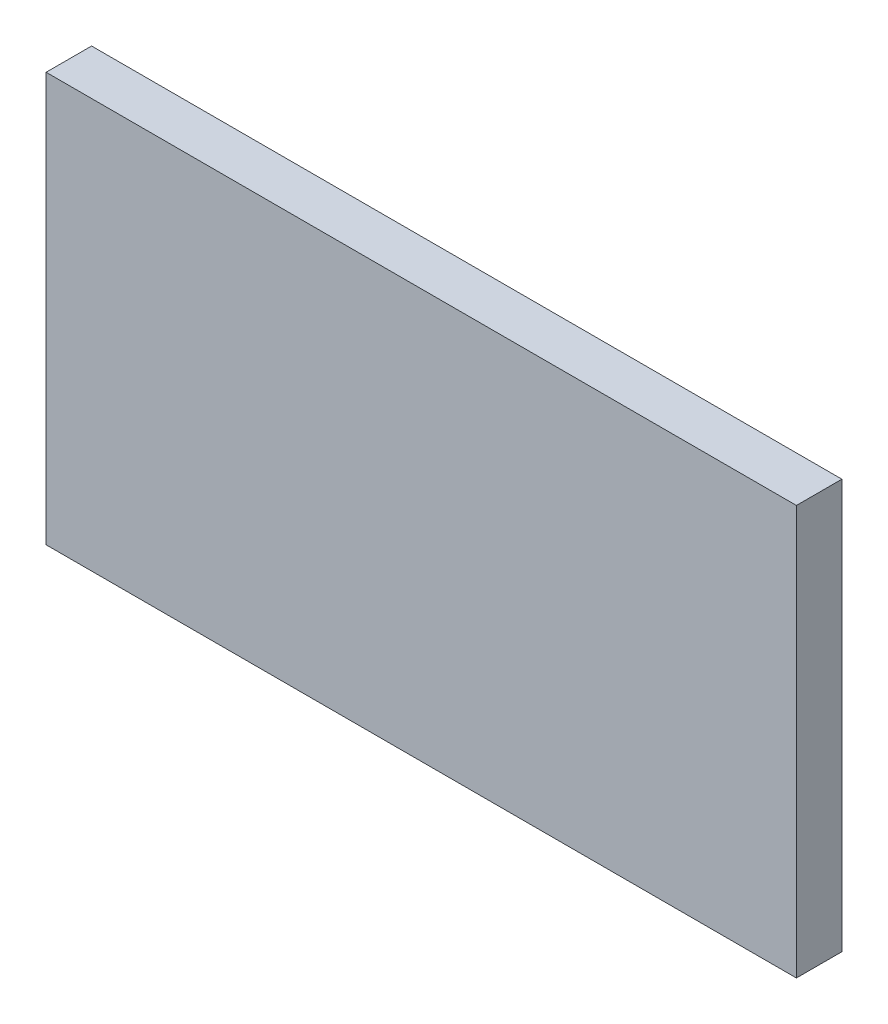
ISO-10303-21;
HEADER;
FILE_DESCRIPTION(('STEP AP214'),'2;1');
FILE_NAME('part.step','',(''),(''),'','','');
FILE_SCHEMA(('AUTOMOTIVE_DESIGN { 1 0 10303 214 1 1 1 1 }'));
ENDSEC;
DATA;
#1=APPLICATION_CONTEXT('core data for automotive mechanical design processes');
#2=APPLICATION_PROTOCOL_DEFINITION('international standard','automotive_design',2000,#1);
#3=PRODUCT_CONTEXT('',#1,'mechanical');
#4=PRODUCT('Part','Part','',(#3));
#5=PRODUCT_RELATED_PRODUCT_CATEGORY('part','',(#4));
#6=PRODUCT_DEFINITION_FORMATION('','',#4);
#7=PRODUCT_DEFINITION_CONTEXT('part definition',#1,'design');
#8=PRODUCT_DEFINITION('design','',#6,#7);
#9=PRODUCT_DEFINITION_SHAPE('','',#8);
#10=(LENGTH_UNIT() NAMED_UNIT(*) SI_UNIT(.MILLI.,.METRE.));
#11=(NAMED_UNIT(*) PLANE_ANGLE_UNIT() SI_UNIT($,.RADIAN.));
#12=(NAMED_UNIT(*) SI_UNIT($,.STERADIAN.) SOLID_ANGLE_UNIT());
#13=UNCERTAINTY_MEASURE_WITH_UNIT(LENGTH_MEASURE(1.E-05),#10,'distance_accuracy_value','');
#14=(GEOMETRIC_REPRESENTATION_CONTEXT(3) GLOBAL_UNCERTAINTY_ASSIGNED_CONTEXT((#13)) GLOBAL_UNIT_ASSIGNED_CONTEXT((#10,
#11,#12)) REPRESENTATION_CONTEXT('',''));
#15=CARTESIAN_POINT('',(0.,0.,0.));
#16=DIRECTION('',(0.,0.,1.));
#17=DIRECTION('',(1.,0.,0.));
#18=AXIS2_PLACEMENT_3D('',#15,#16,#17);
#19=CARTESIAN_POINT('',(0.,0.,200.));
#20=DIRECTION('',(1.,0.,0.));
#21=DIRECTION('',(0.,0.,-1.));
#22=AXIS2_PLACEMENT_3D('',#19,#20,#21);
#23=PLANE('',#22);
#24=DIRECTION('',(0.,-1.,0.));
#25=VECTOR('',#24,1.);
#26=CARTESIAN_POINT('',(0.,0.,0.));
#27=LINE('',#26,#25);
#28=CARTESIAN_POINT('',(0.,1800.,0.));
#29=VERTEX_POINT('',#28);
#30=CARTESIAN_POINT('',(0.,0.,0.));
#31=VERTEX_POINT('',#30);
#32=EDGE_CURVE('E96',#29,#31,#27,.T.);
#33=ORIENTED_EDGE('',*,*,#32,.T.);
#34=DIRECTION('',(0.,0.,-1.));
#35=VECTOR('',#34,1.);
#36=CARTESIAN_POINT('',(0.,0.,200.));
#37=LINE('',#36,#35);
#38=CARTESIAN_POINT('',(0.,0.,200.));
#39=VERTEX_POINT('',#38);
#40=EDGE_CURVE('E11',#39,#31,#37,.T.);
#41=ORIENTED_EDGE('',*,*,#40,.F.);
#42=DIRECTION('',(0.,-1.,0.));
#43=VECTOR('',#42,1.);
#44=CARTESIAN_POINT('',(0.,0.,200.));
#45=LINE('',#44,#43);
#46=CARTESIAN_POINT('',(0.,1800.,200.));
#47=VERTEX_POINT('',#46);
#48=EDGE_CURVE('E84',#47,#39,#45,.T.);
#49=ORIENTED_EDGE('',*,*,#48,.F.);
#50=DIRECTION('',(0.,0.,-1.));
#51=VECTOR('',#50,1.);
#52=CARTESIAN_POINT('',(0.,1800.,200.));
#53=LINE('',#52,#51);
#54=EDGE_CURVE('E92',#47,#29,#53,.T.);
#55=ORIENTED_EDGE('',*,*,#54,.T.);
#56=EDGE_LOOP('',(#33,#41,#49,#55));
#57=FACE_BOUND('',#56,.T.);
#58=ADVANCED_FACE('F33',(#57),#23,.F.);
#59=CARTESIAN_POINT('',(0.,0.,200.));
#60=DIRECTION('',(0.,1.,0.));
#61=DIRECTION('',(0.,0.,1.));
#62=AXIS2_PLACEMENT_3D('',#59,#60,#61);
#63=PLANE('',#62);
#64=DIRECTION('',(1.,0.,0.));
#65=VECTOR('',#64,1.);
#66=CARTESIAN_POINT('',(0.,0.,0.));
#67=LINE('',#66,#65);
#68=CARTESIAN_POINT('',(3300.,0.,0.));
#69=VERTEX_POINT('',#68);
#70=EDGE_CURVE('E88',#31,#69,#67,.T.);
#71=ORIENTED_EDGE('',*,*,#70,.T.);
#72=DIRECTION('',(0.,0.,-1.));
#73=VECTOR('',#72,1.);
#74=CARTESIAN_POINT('',(3300.,0.,200.));
#75=LINE('',#74,#73);
#76=CARTESIAN_POINT('',(3300.,0.,200.));
#77=VERTEX_POINT('',#76);
#78=EDGE_CURVE('E41',#77,#69,#75,.T.);
#79=ORIENTED_EDGE('',*,*,#78,.F.);
#80=DIRECTION('',(1.,0.,0.));
#81=VECTOR('',#80,1.);
#82=CARTESIAN_POINT('',(0.,0.,200.));
#83=LINE('',#82,#81);
#84=EDGE_CURVE('E79',#39,#77,#83,.T.);
#85=ORIENTED_EDGE('',*,*,#84,.F.);
#86=ORIENTED_EDGE('',*,*,#40,.T.);
#87=EDGE_LOOP('',(#71,#79,#85,#86));
#88=FACE_BOUND('',#87,.T.);
#89=ADVANCED_FACE('F87',(#88),#63,.F.);
#90=CARTESIAN_POINT('',(3300.,0.,200.));
#91=DIRECTION('',(-1.,0.,0.));
#92=DIRECTION('',(0.,0.,1.));
#93=AXIS2_PLACEMENT_3D('',#90,#91,#92);
#94=PLANE('',#93);
#95=DIRECTION('',(0.,1.,0.));
#96=VECTOR('',#95,1.);
#97=CARTESIAN_POINT('',(3300.,0.,0.));
#98=LINE('',#97,#96);
#99=CARTESIAN_POINT('',(3300.,1800.,0.));
#100=VERTEX_POINT('',#99);
#101=EDGE_CURVE('E66',#69,#100,#98,.T.);
#102=ORIENTED_EDGE('',*,*,#101,.T.);
#103=DIRECTION('',(0.,0.,-1.));
#104=VECTOR('',#103,1.);
#105=CARTESIAN_POINT('',(3300.,1800.,200.));
#106=LINE('',#105,#104);
#107=CARTESIAN_POINT('',(3300.,1800.,200.));
#108=VERTEX_POINT('',#107);
#109=EDGE_CURVE('E89',#108,#100,#106,.T.);
#110=ORIENTED_EDGE('',*,*,#109,.F.);
#111=DIRECTION('',(0.,1.,0.));
#112=VECTOR('',#111,1.);
#113=CARTESIAN_POINT('',(3300.,0.,200.));
#114=LINE('',#113,#112);
#115=EDGE_CURVE('E82',#77,#108,#114,.T.);
#116=ORIENTED_EDGE('',*,*,#115,.F.);
#117=ORIENTED_EDGE('',*,*,#78,.T.);
#118=EDGE_LOOP('',(#102,#110,#116,#117));
#119=FACE_BOUND('',#118,.T.);
#120=ADVANCED_FACE('F90',(#119),#94,.F.);
#121=CARTESIAN_POINT('',(0.,1800.,200.));
#122=DIRECTION('',(0.,-1.,0.));
#123=DIRECTION('',(1.,0.,0.));
#124=AXIS2_PLACEMENT_3D('',#121,#122,#123);
#125=PLANE('',#124);
#126=DIRECTION('',(-1.,0.,0.));
#127=VECTOR('',#126,1.);
#128=CARTESIAN_POINT('',(0.,1800.,0.));
#129=LINE('',#128,#127);
#130=EDGE_CURVE('E72',#100,#29,#129,.T.);
#131=ORIENTED_EDGE('',*,*,#130,.T.);
#132=ORIENTED_EDGE('',*,*,#54,.F.);
#133=DIRECTION('',(-1.,0.,0.));
#134=VECTOR('',#133,1.);
#135=CARTESIAN_POINT('',(0.,1800.,200.));
#136=LINE('',#135,#134);
#137=EDGE_CURVE('E49',#108,#47,#136,.T.);
#138=ORIENTED_EDGE('',*,*,#137,.F.);
#139=ORIENTED_EDGE('',*,*,#109,.T.);
#140=EDGE_LOOP('',(#131,#132,#138,#139));
#141=FACE_BOUND('',#140,.T.);
#142=ADVANCED_FACE('F103',(#141),#125,.F.);
#143=CARTESIAN_POINT('',(0.,0.,200.));
#144=DIRECTION('',(0.,0.,-1.));
#145=DIRECTION('',(-1.,0.,0.));
#146=AXIS2_PLACEMENT_3D('',#143,#144,#145);
#147=PLANE('',#146);
#148=ORIENTED_EDGE('',*,*,#48,.T.);
#149=ORIENTED_EDGE('',*,*,#84,.T.);
#150=ORIENTED_EDGE('',*,*,#115,.T.);
#151=ORIENTED_EDGE('',*,*,#137,.T.);
#152=EDGE_LOOP('',(#148,#149,#150,#151));
#153=FACE_BOUND('',#152,.T.);
#154=ADVANCED_FACE('F80',(#153),#147,.F.);
#155=CARTESIAN_POINT('',(0.,0.,0.));
#156=DIRECTION('',(0.,0.,-1.));
#157=DIRECTION('',(-1.,0.,0.));
#158=AXIS2_PLACEMENT_3D('',#155,#156,#157);
#159=PLANE('',#158);
#160=ORIENTED_EDGE('',*,*,#32,.F.);
#161=ORIENTED_EDGE('',*,*,#130,.F.);
#162=ORIENTED_EDGE('',*,*,#101,.F.);
#163=ORIENTED_EDGE('',*,*,#70,.F.);
#164=EDGE_LOOP('',(#160,#161,#162,#163));
#165=FACE_BOUND('',#164,.T.);
#166=ADVANCED_FACE('F106',(#165),#159,.T.);
#167=CLOSED_SHELL('',(#58,#89,#120,#142,#154,#166));
#168=MANIFOLD_SOLID_BREP('B2',#167);
#169=ADVANCED_BREP_SHAPE_REPRESENTATION('',(#18,#168),#14);
#170=SHAPE_DEFINITION_REPRESENTATION(#9,#169);
ENDSEC;
END-ISO-10303-21;
